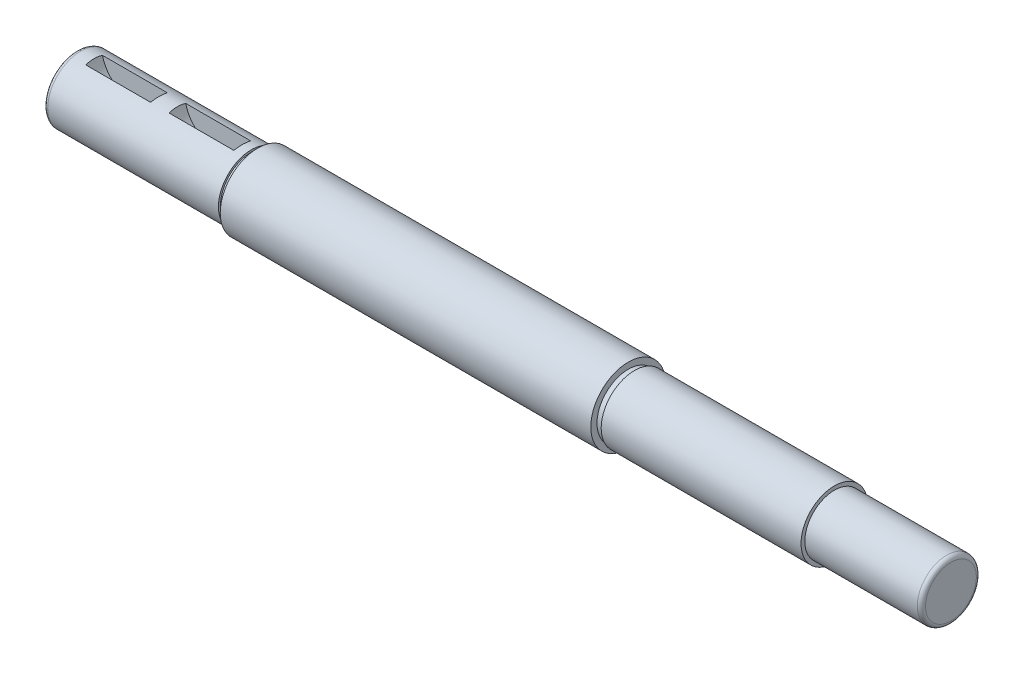
ISO-10303-21;
HEADER;
FILE_DESCRIPTION(('STEP AP214'),'2;1');
FILE_NAME('part.step','',(''),(''),'','','');
FILE_SCHEMA(('AUTOMOTIVE_DESIGN { 1 0 10303 214 1 1 1 1 }'));
ENDSEC;
DATA;
#1=APPLICATION_CONTEXT('core data for automotive mechanical design processes');
#2=APPLICATION_PROTOCOL_DEFINITION('international standard','automotive_design',2000,#1);
#3=PRODUCT_CONTEXT('',#1,'mechanical');
#4=PRODUCT('Part','Part','',(#3));
#5=PRODUCT_RELATED_PRODUCT_CATEGORY('part','',(#4));
#6=PRODUCT_DEFINITION_FORMATION('','',#4);
#7=PRODUCT_DEFINITION_CONTEXT('part definition',#1,'design');
#8=PRODUCT_DEFINITION('design','',#6,#7);
#9=PRODUCT_DEFINITION_SHAPE('','',#8);
#10=(LENGTH_UNIT() NAMED_UNIT(*) SI_UNIT(.MILLI.,.METRE.));
#11=(NAMED_UNIT(*) PLANE_ANGLE_UNIT() SI_UNIT($,.RADIAN.));
#12=(NAMED_UNIT(*) SI_UNIT($,.STERADIAN.) SOLID_ANGLE_UNIT());
#13=UNCERTAINTY_MEASURE_WITH_UNIT(LENGTH_MEASURE(1.E-05),#10,'distance_accuracy_value','');
#14=(GEOMETRIC_REPRESENTATION_CONTEXT(3) GLOBAL_UNCERTAINTY_ASSIGNED_CONTEXT((#13)) GLOBAL_UNIT_ASSIGNED_CONTEXT((#10,
#11,#12)) REPRESENTATION_CONTEXT('',''));
#15=CARTESIAN_POINT('',(0.,0.,0.));
#16=DIRECTION('',(0.,0.,1.));
#17=DIRECTION('',(1.,0.,0.));
#18=AXIS2_PLACEMENT_3D('',#15,#16,#17);
#19=CARTESIAN_POINT('',(-43.2188775510235,0.,0.));
#20=DIRECTION('',(-1.,0.,0.));
#21=DIRECTION('',(0.,0.,0.999999999999999));
#22=AXIS2_PLACEMENT_3D('',#19,#20,#21);
#23=CYLINDRICAL_SURFACE('',#22,12.573);
#24=CARTESIAN_POINT('',(-47.9318923712861,12.1655128950656,3.1749999999999));
#25=CARTESIAN_POINT('',(-47.9423587204252,12.2093989522607,3.00684567429126));
#26=CARTESIAN_POINT('',(-47.9517585812594,12.2498073403399,2.83774160807929));
#27=CARTESIAN_POINT('',(-47.9686036364341,12.3235949017887,2.49791376370056));
#28=CARTESIAN_POINT('',(-47.9760488716091,12.3569742220007,2.32719001944792));
#29=CARTESIAN_POINT('',(-47.9957208671903,12.4464611744974,1.81299330604268));
#30=CARTESIAN_POINT('',(-48.0052836232186,12.4919165162094,1.46749976980847));
#31=CARTESIAN_POINT('',(-48.0180752497638,12.5533273824793,0.781306161602188));
#32=CARTESIAN_POINT('',(-48.0214355502917,12.5698946152415,0.44066217812384));
#33=CARTESIAN_POINT('',(-48.0225404054115,12.5753104400998,-0.240715360624144));
#34=CARTESIAN_POINT('',(-48.0202870936926,12.5641695638298,-0.581448832655653));
#35=CARTESIAN_POINT('',(-48.0093757584653,12.5114222459546,-1.29937082874842));
#36=CARTESIAN_POINT('',(-48.0000211046213,12.4665075345471,-1.67631642960017));
#37=CARTESIAN_POINT('',(-47.9797005834582,12.3734388378274,-2.23946049091177));
#38=CARTESIAN_POINT('',(-47.9718116174037,12.3378374790666,-2.42793171445026));
#39=CARTESIAN_POINT('',(-47.9536777639308,12.2580731081272,-2.80298583265816));
#40=CARTESIAN_POINT('',(-47.9434323155065,12.2139080575913,-2.98956826660437));
#41=CARTESIAN_POINT('',(-47.9318923712861,12.1655128950655,-3.1750000000001));
#42=B_SPLINE_CURVE_WITH_KNOTS('',3,(#24,#25,#26,#27,#28,#29,#30,#31,#32,#33,#34,#35,#36,#37,#38,
#39,#40,#41),.UNSPECIFIED.,.F.,.F.,(4,2,2,2,2,2,2,2,4),(0.,0.522218817984299,1.044426725363,
2.08885774968565,3.11089136797897,4.13253657872747,5.26991720612298,5.8456320404076,
6.4214840767705),.UNSPECIFIED.);
#43=CARTESIAN_POINT('',(-47.9318923712861,12.1655128950656,3.1749999999999));
#44=VERTEX_POINT('',#43);
#45=CARTESIAN_POINT('',(-47.9318923712861,12.1655128950655,-3.1750000000001));
#46=VERTEX_POINT('',#45);
#47=EDGE_CURVE('E242',#44,#46,#42,.T.);
#48=ORIENTED_EDGE('',*,*,#47,.T.);
#49=DIRECTION('',(-1.,0.,0.));
#50=VECTOR('',#49,1.);
#51=CARTESIAN_POINT('',(-43.2188775510235,12.1655128950655,-3.1750000000001));
#52=LINE('',#51,#50);
#53=CARTESIAN_POINT('',(-23.2254300776882,12.1655128950655,-3.1750000000001));
#54=VERTEX_POINT('',#53);
#55=EDGE_CURVE('E334',#54,#46,#52,.T.);
#56=ORIENTED_EDGE('',*,*,#55,.F.);
#57=CARTESIAN_POINT('',(-23.2254300776882,12.1655128950655,-3.1750000000001));
#58=CARTESIAN_POINT('',(-23.214963728549,12.2093989522607,-3.00684567429146));
#59=CARTESIAN_POINT('',(-23.2055638677149,12.2498073403398,-2.83774160807948));
#60=CARTESIAN_POINT('',(-23.1887188125401,12.3235949017887,-2.49791376370075));
#61=CARTESIAN_POINT('',(-23.1812735773652,12.3569742220007,-2.32719001944811));
#62=CARTESIAN_POINT('',(-23.1616015817839,12.4464611744974,-1.81299330604286));
#63=CARTESIAN_POINT('',(-23.1520388257557,12.4919165162094,-1.46749976980864));
#64=CARTESIAN_POINT('',(-23.1392471992105,12.5533273824793,-0.781306161602339));
#65=CARTESIAN_POINT('',(-23.1358868986825,12.5698946152414,-0.440662178123988));
#66=CARTESIAN_POINT('',(-23.1347820435627,12.5753104400998,0.240715360624003));
#67=CARTESIAN_POINT('',(-23.1370353552817,12.5641695638299,0.581448832655516));
#68=CARTESIAN_POINT('',(-23.1479466905089,12.5114222459547,1.29937082874827));
#69=CARTESIAN_POINT('',(-23.1573013443529,12.4665075345471,1.6763164296));
#70=CARTESIAN_POINT('',(-23.177621865516,12.3734388378273,2.23946049091158));
#71=CARTESIAN_POINT('',(-23.1855108315705,12.3378374790666,2.42793171445008));
#72=CARTESIAN_POINT('',(-23.2036446850434,12.2580731081272,2.80298583265797));
#73=CARTESIAN_POINT('',(-23.2138901334677,12.2139080575914,2.98956826660418));
#74=CARTESIAN_POINT('',(-23.2254300776882,12.1655128950656,3.1749999999999));
#75=B_SPLINE_CURVE_WITH_KNOTS('',3,(#57,#58,#59,#60,#61,#62,#63,#64,#65,#66,#67,#68,#69,#70,#71,
#72,#73,#74),.UNSPECIFIED.,.F.,.F.,(4,2,2,2,2,2,2,2,4),(0.,0.522218817984299,1.04442672536301,
2.08885774968569,3.11089136797903,4.13253657872752,5.269917206123,5.84563204040762,
6.4214840767705),.UNSPECIFIED.);
#76=CARTESIAN_POINT('',(-23.2254300776882,12.1655128950656,3.1749999999999));
#77=VERTEX_POINT('',#76);
#78=EDGE_CURVE('E249',#54,#77,#75,.T.);
#79=ORIENTED_EDGE('',*,*,#78,.T.);
#80=DIRECTION('',(-1.,0.,0.));
#81=VECTOR('',#80,1.);
#82=CARTESIAN_POINT('',(-43.2188775510235,12.1655128950656,3.1749999999999));
#83=LINE('',#82,#81);
#84=EDGE_CURVE('E239',#77,#44,#83,.T.);
#85=ORIENTED_EDGE('',*,*,#84,.T.);
#86=EDGE_LOOP('',(#48,#56,#79,#85));
#87=FACE_BOUND('',#86,.T.);
#88=CARTESIAN_POINT('',(-53.0411612244871,0.,0.));
#89=DIRECTION('',(1.,0.,0.));
#90=DIRECTION('',(0.,0.,-0.999999999999999));
#91=AXIS2_PLACEMENT_3D('',#88,#89,#90);
#92=CIRCLE('',#91,12.573);
#93=CARTESIAN_POINT('',(-53.0411612244871,1.25629506797509E-13,-12.573));
#94=VERTEX_POINT('',#93);
#95=EDGE_CURVE('E236',#94,#94,#92,.T.);
#96=ORIENTED_EDGE('',*,*,#95,.T.);
#97=EDGE_LOOP('',(#96));
#98=FACE_BOUND('',#97,.T.);
#99=CARTESIAN_POINT('',(12.0463387755129,0.,0.));
#100=DIRECTION('',(-1.,0.,0.));
#101=DIRECTION('',(0.,0.,0.999999999999999));
#102=AXIS2_PLACEMENT_3D('',#99,#100,#101);
#103=CIRCLE('',#102,12.573);
#104=CARTESIAN_POINT('',(12.0463387755129,-1.25629506797509E-13,12.573));
#105=VERTEX_POINT('',#104);
#106=EDGE_CURVE('E224',#105,#105,#103,.T.);
#107=ORIENTED_EDGE('',*,*,#106,.T.);
#108=EDGE_LOOP('',(#107));
#109=FACE_BOUND('',#108,.T.);
#110=CARTESIAN_POINT('',(-16.1818923712861,12.1655128950656,3.1749999999999));
#111=CARTESIAN_POINT('',(-16.1923587204252,12.2093989522607,3.00684567429125));
#112=CARTESIAN_POINT('',(-16.2017585812594,12.2498073403398,2.83774160807928));
#113=CARTESIAN_POINT('',(-16.2186036364341,12.3235949017887,2.49791376370056));
#114=CARTESIAN_POINT('',(-16.2260488716091,12.3569742220007,2.32719001944793));
#115=CARTESIAN_POINT('',(-16.2457208671903,12.4464611744974,1.81299330604268));
#116=CARTESIAN_POINT('',(-16.2552836232186,12.4919165162094,1.46749976980847));
#117=CARTESIAN_POINT('',(-16.2680752497638,12.5533273824793,0.781306161602172));
#118=CARTESIAN_POINT('',(-16.2714355502917,12.5698946152414,0.440662178123828));
#119=CARTESIAN_POINT('',(-16.2725404054115,12.5753104400998,-0.24071536062415));
#120=CARTESIAN_POINT('',(-16.2702870936926,12.5641695638299,-0.581448832655656));
#121=CARTESIAN_POINT('',(-16.2593757584653,12.5114222459548,-1.2993708287484));
#122=CARTESIAN_POINT('',(-16.2500211046213,12.4665075345471,-1.67631642960012));
#123=CARTESIAN_POINT('',(-16.2297005834582,12.3734388378273,-2.2394604909117));
#124=CARTESIAN_POINT('',(-16.2218116174037,12.3378374790665,-2.4279317144502));
#125=CARTESIAN_POINT('',(-16.2036777639308,12.2580731081272,-2.80298583265809));
#126=CARTESIAN_POINT('',(-16.1934323155065,12.2139080575914,-2.98956826660431));
#127=CARTESIAN_POINT('',(-16.1818923712861,12.1655128950656,-3.17500000000005));
#128=B_SPLINE_CURVE_WITH_KNOTS('',3,(#110,#111,#112,#113,#114,#115,#116,#117,#118,#119,#120,
#121,#122,#123,#124,#125,#126,#127),.UNSPECIFIED.,.F.,.F.,(4,2,2,2,2,2,2,2,4),(0.,
0.522218817984276,1.04442672536296,2.08885774968564,3.11089136797896,4.13253657872742,
5.26991720612291,5.84563204040753,6.42148407677041),.UNSPECIFIED.);
#129=CARTESIAN_POINT('',(-16.1818923712861,12.1655128950656,3.1749999999999));
#130=VERTEX_POINT('',#129);
#131=CARTESIAN_POINT('',(-16.1818923712861,12.1655128950656,-3.17500000000005));
#132=VERTEX_POINT('',#131);
#133=EDGE_CURVE('E303',#130,#132,#128,.T.);
#134=ORIENTED_EDGE('',*,*,#133,.T.);
#135=DIRECTION('',(-1.,0.,0.));
#136=VECTOR('',#135,1.);
#137=CARTESIAN_POINT('',(-43.2188775510235,12.1655128950655,-3.1750000000001));
#138=LINE('',#137,#136);
#139=CARTESIAN_POINT('',(8.52456992231182,12.1655128950656,-3.17500000000005));
#140=VERTEX_POINT('',#139);
#141=EDGE_CURVE('E306',#140,#132,#138,.T.);
#142=ORIENTED_EDGE('',*,*,#141,.F.);
#143=CARTESIAN_POINT('',(8.52456992231182,12.1655128950656,-3.17500000000005));
#144=CARTESIAN_POINT('',(8.53503627145099,12.2093989522607,-3.00684567429139));
#145=CARTESIAN_POINT('',(8.54443613228513,12.2498073403398,-2.83774160807942));
#146=CARTESIAN_POINT('',(8.5612811874599,12.3235949017886,-2.49791376370069));
#147=CARTESIAN_POINT('',(8.56872642263484,12.3569742220006,-2.32719001944806));
#148=CARTESIAN_POINT('',(8.58839841821606,12.4464611744974,-1.81299330604281));
#149=CARTESIAN_POINT('',(8.59796117424434,12.4919165162094,-1.4674997698086));
#150=CARTESIAN_POINT('',(8.61075280078953,12.5533273824793,-0.781306161602295));
#151=CARTESIAN_POINT('',(8.61411310131751,12.5698946152414,-0.440662178123945));
#152=CARTESIAN_POINT('',(8.6152179564373,12.5753104400998,0.240715360624043));
#153=CARTESIAN_POINT('',(8.61296464471831,12.5641695638299,0.581448832655554));
#154=CARTESIAN_POINT('',(8.60205330949107,12.5114222459547,1.2993708287483));
#155=CARTESIAN_POINT('',(8.59269865564706,12.4665075345471,1.67631642960001));
#156=CARTESIAN_POINT('',(8.57237813448399,12.3734388378273,2.23946049091158));
#157=CARTESIAN_POINT('',(8.56448916842954,12.3378374790665,2.42793171445007));
#158=CARTESIAN_POINT('',(8.54635531495656,12.2580731081272,2.80298583265795));
#159=CARTESIAN_POINT('',(8.53610986653225,12.2139080575914,2.98956826660416));
#160=CARTESIAN_POINT('',(8.52456992231182,12.1655128950656,3.1749999999999));
#161=B_SPLINE_CURVE_WITH_KNOTS('',3,(#143,#144,#145,#146,#147,#148,#149,#150,#151,#152,#153,
#154,#155,#156,#157,#158,#159,#160),.UNSPECIFIED.,.F.,.F.,(4,2,2,2,2,2,2,2,4),(0.,
0.522218817984283,1.04442672536298,2.08885774968565,3.11089136797899,4.13253657872747,
5.26991720612293,5.84563204040753,6.42148407677039),.UNSPECIFIED.);
#162=CARTESIAN_POINT('',(8.52456992231182,12.1655128950656,3.1749999999999));
#163=VERTEX_POINT('',#162);
#164=EDGE_CURVE('E310',#140,#163,#161,.T.);
#165=ORIENTED_EDGE('',*,*,#164,.T.);
#166=DIRECTION('',(-1.,0.,0.));
#167=VECTOR('',#166,1.);
#168=CARTESIAN_POINT('',(-43.2188775510235,12.1655128950656,3.1749999999999));
#169=LINE('',#168,#167);
#170=EDGE_CURVE('E307',#163,#130,#169,.T.);
#171=ORIENTED_EDGE('',*,*,#170,.T.);
#172=EDGE_LOOP('',(#134,#142,#165,#171));
#173=FACE_BOUND('',#172,.T.);
#174=ADVANCED_FACE('F47',(#87,#98,#109,#173),#23,.T.);
#175=CARTESIAN_POINT('',(-54.6286612244871,0.,0.));
#176=DIRECTION('',(1.,0.,0.));
#177=DIRECTION('',(0.,0.,-0.999999999999999));
#178=AXIS2_PLACEMENT_3D('',#175,#176,#177);
#179=PLANE('',#178);
#180=CARTESIAN_POINT('',(-54.6286612244871,0.,0.));
#181=DIRECTION('',(1.,0.,0.));
#182=DIRECTION('',(0.,0.,-0.999999999999999));
#183=AXIS2_PLACEMENT_3D('',#180,#181,#182);
#184=CIRCLE('',#183,10.9855);
#185=CARTESIAN_POINT('',(-54.6286612244871,1.09767195333177E-13,-10.9855));
#186=VERTEX_POINT('',#185);
#187=EDGE_CURVE('E233',#186,#186,#184,.F.);
#188=ORIENTED_EDGE('',*,*,#187,.T.);
#189=EDGE_LOOP('',(#188));
#190=FACE_BOUND('',#189,.T.);
#191=ADVANCED_FACE('F285',(#190),#179,.F.);
#192=CARTESIAN_POINT('',(12.0463387755129,12.5730000000002,0.));
#193=DIRECTION('',(-1.,0.,0.));
#194=DIRECTION('',(0.,0.,0.999999999999999));
#195=AXIS2_PLACEMENT_3D('',#192,#193,#194);
#196=PLANE('',#195);
#197=ORIENTED_EDGE('',*,*,#106,.F.);
#198=EDGE_LOOP('',(#197));
#199=FACE_BOUND('',#198,.T.);
#200=CARTESIAN_POINT('',(12.0463387755129,0.,0.));
#201=DIRECTION('',(-1.,0.,0.));
#202=DIRECTION('',(0.,0.,0.999999999999999));
#203=AXIS2_PLACEMENT_3D('',#200,#201,#202);
#204=CIRCLE('',#203,11.77925);
#205=CARTESIAN_POINT('',(12.0463387755129,-1.17698351065343E-13,11.77925));
#206=VERTEX_POINT('',#205);
#207=EDGE_CURVE('E221',#206,#206,#204,.T.);
#208=ORIENTED_EDGE('',*,*,#207,.T.);
#209=EDGE_LOOP('',(#208));
#210=FACE_BOUND('',#209,.T.);
#211=ADVANCED_FACE('F290',(#199,#210),#196,.F.);
#212=CARTESIAN_POINT('',(-43.2188775510235,0.,0.));
#213=DIRECTION('',(-1.,0.,0.));
#214=DIRECTION('',(0.,0.,0.999999999999999));
#215=AXIS2_PLACEMENT_3D('',#212,#213,#214);
#216=CYLINDRICAL_SURFACE('',#215,11.77925);
#217=ORIENTED_EDGE('',*,*,#207,.F.);
#218=EDGE_LOOP('',(#217));
#219=FACE_BOUND('',#218,.T.);
#220=CARTESIAN_POINT('',(14.4275887755129,0.,0.));
#221=DIRECTION('',(-1.,0.,0.));
#222=DIRECTION('',(0.,0.,0.999999999999999));
#223=AXIS2_PLACEMENT_3D('',#220,#221,#222);
#224=CIRCLE('',#223,11.77925);
#225=CARTESIAN_POINT('',(14.4275887755129,-1.17698351065343E-13,11.77925));
#226=VERTEX_POINT('',#225);
#227=EDGE_CURVE('E218',#226,#226,#224,.T.);
#228=ORIENTED_EDGE('',*,*,#227,.T.);
#229=EDGE_LOOP('',(#228));
#230=FACE_BOUND('',#229,.T.);
#231=ADVANCED_FACE('F491',(#219,#230),#216,.T.);
#232=CARTESIAN_POINT('',(14.4275887755129,11.7792500000003,0.));
#233=DIRECTION('',(1.,0.,0.));
#234=DIRECTION('',(0.,0.,-0.999999999999999));
#235=AXIS2_PLACEMENT_3D('',#232,#233,#234);
#236=PLANE('',#235);
#237=ORIENTED_EDGE('',*,*,#227,.F.);
#238=EDGE_LOOP('',(#237));
#239=FACE_BOUND('',#238,.T.);
#240=CARTESIAN_POINT('',(14.4275887755129,0.,0.));
#241=DIRECTION('',(-1.,0.,0.));
#242=DIRECTION('',(0.,0.,0.999999999999999));
#243=AXIS2_PLACEMENT_3D('',#240,#241,#242);
#244=CIRCLE('',#243,14.2748);
#245=CARTESIAN_POINT('',(14.4275887755129,-1.42633904687273E-13,14.2748));
#246=VERTEX_POINT('',#245);
#247=EDGE_CURVE('E215',#246,#246,#244,.T.);
#248=ORIENTED_EDGE('',*,*,#247,.T.);
#249=EDGE_LOOP('',(#248));
#250=FACE_BOUND('',#249,.T.);
#251=ADVANCED_FACE('F482',(#239,#250),#236,.F.);
#252=CARTESIAN_POINT('',(-43.2188775510235,0.,0.));
#253=DIRECTION('',(-1.,0.,0.));
#254=DIRECTION('',(0.,0.,0.999999999999999));
#255=AXIS2_PLACEMENT_3D('',#252,#253,#254);
#256=CYLINDRICAL_SURFACE('',#255,14.2748);
#257=ORIENTED_EDGE('',*,*,#247,.F.);
#258=EDGE_LOOP('',(#257));
#259=FACE_BOUND('',#258,.T.);
#260=CARTESIAN_POINT('',(155.715088775513,1.94289029309402E-13,0.));
#261=DIRECTION('',(-1.,0.,0.));
#262=DIRECTION('',(0.,0.,0.999999999999999));
#263=AXIS2_PLACEMENT_3D('',#260,#261,#262);
#264=CIRCLE('',#263,14.2748);
#265=CARTESIAN_POINT('',(155.715088775513,0.,14.2748));
#266=VERTEX_POINT('',#265);
#267=EDGE_CURVE('E212',#266,#266,#264,.T.);
#268=ORIENTED_EDGE('',*,*,#267,.T.);
#269=EDGE_LOOP('',(#268));
#270=FACE_BOUND('',#269,.T.);
#271=ADVANCED_FACE('F473',(#259,#270),#256,.T.);
#272=CARTESIAN_POINT('',(155.715088775513,14.2748000000005,-1.70002900645727E-13));
#273=DIRECTION('',(-1.,0.,0.));
#274=DIRECTION('',(0.,0.,0.999999999999999));
#275=AXIS2_PLACEMENT_3D('',#272,#273,#274);
#276=PLANE('',#275);
#277=ORIENTED_EDGE('',*,*,#267,.F.);
#278=EDGE_LOOP('',(#277));
#279=FACE_BOUND('',#278,.T.);
#280=CARTESIAN_POINT('',(155.715088775513,1.94289029309402E-13,0.));
#281=DIRECTION('',(-1.,0.,0.));
#282=DIRECTION('',(0.,0.,0.999999999999999));
#283=AXIS2_PLACEMENT_3D('',#280,#281,#282);
#284=CIRCLE('',#283,11.9126);
#285=CARTESIAN_POINT('',(155.715088775513,0.,11.9126));
#286=VERTEX_POINT('',#285);
#287=EDGE_CURVE('E209',#286,#286,#284,.T.);
#288=ORIENTED_EDGE('',*,*,#287,.T.);
#289=EDGE_LOOP('',(#288));
#290=FACE_BOUND('',#289,.T.);
#291=ADVANCED_FACE('F464',(#279,#290),#276,.F.);
#292=CARTESIAN_POINT('',(-43.2188775510235,0.,0.));
#293=DIRECTION('',(-1.,0.,0.));
#294=DIRECTION('',(0.,0.,0.999999999999999));
#295=AXIS2_PLACEMENT_3D('',#292,#293,#294);
#296=CYLINDRICAL_SURFACE('',#295,11.9126);
#297=ORIENTED_EDGE('',*,*,#287,.F.);
#298=EDGE_LOOP('',(#297));
#299=FACE_BOUND('',#298,.T.);
#300=CARTESIAN_POINT('',(158.096338775513,1.94289029309402E-13,0.));
#301=DIRECTION('',(-1.,0.,0.));
#302=DIRECTION('',(0.,0.,0.999999999999999));
#303=AXIS2_PLACEMENT_3D('',#300,#301,#302);
#304=CIRCLE('',#303,11.9126);
#305=CARTESIAN_POINT('',(158.096338775513,0.,11.9126));
#306=VERTEX_POINT('',#305);
#307=EDGE_CURVE('E206',#306,#306,#304,.T.);
#308=ORIENTED_EDGE('',*,*,#307,.T.);
#309=EDGE_LOOP('',(#308));
#310=FACE_BOUND('',#309,.T.);
#311=ADVANCED_FACE('F456',(#299,#310),#296,.T.);
#312=CARTESIAN_POINT('',(158.096338775513,11.9126000000003,0.));
#313=DIRECTION('',(1.,0.,0.));
#314=DIRECTION('',(0.,0.,-0.999999999999999));
#315=AXIS2_PLACEMENT_3D('',#312,#313,#314);
#316=PLANE('',#315);
#317=ORIENTED_EDGE('',*,*,#307,.F.);
#318=EDGE_LOOP('',(#317));
#319=FACE_BOUND('',#318,.T.);
#320=CARTESIAN_POINT('',(158.096338775513,1.94289029309402E-13,0.));
#321=DIRECTION('',(-1.,0.,0.));
#322=DIRECTION('',(0.,0.,0.999999999999999));
#323=AXIS2_PLACEMENT_3D('',#320,#321,#322);
#324=CIRCLE('',#323,12.70635);
#325=CARTESIAN_POINT('',(158.096338775513,0.,12.70635));
#326=VERTEX_POINT('',#325);
#327=EDGE_CURVE('E203',#326,#326,#324,.T.);
#328=ORIENTED_EDGE('',*,*,#327,.T.);
#329=EDGE_LOOP('',(#328));
#330=FACE_BOUND('',#329,.T.);
#331=ADVANCED_FACE('F281',(#319,#330),#316,.F.);
#332=CARTESIAN_POINT('',(-43.2188775510235,0.,0.));
#333=DIRECTION('',(-1.,0.,0.));
#334=DIRECTION('',(0.,0.,0.999999999999999));
#335=AXIS2_PLACEMENT_3D('',#332,#333,#334);
#336=CYLINDRICAL_SURFACE('',#335,12.70635);
#337=CARTESIAN_POINT('',(225.219373074706,-12.303280266762,3.17500000000001));
#338=CARTESIAN_POINT('',(225.229822273497,-12.3471642383812,3.0049486631984));
#339=CARTESIAN_POINT('',(225.239197201386,-12.3875312541663,2.83394895664347));
#340=CARTESIAN_POINT('',(225.255978671013,-12.4611579252856,2.49033196690938));
#341=CARTESIAN_POINT('',(225.26338523157,-12.4944176485716,2.31771469921197));
#342=CARTESIAN_POINT('',(225.282923192225,-12.5834283953145,1.79784145874841));
#343=CARTESIAN_POINT('',(225.292372351811,-12.6284087284307,1.4485728335441));
#344=CARTESIAN_POINT('',(225.304892755237,-12.6885828043217,0.754904803232514));
#345=CARTESIAN_POINT('',(225.308095082169,-12.7043883577387,0.410559342499162));
#346=CARTESIAN_POINT('',(225.308827897382,-12.7079669708953,-0.278203723184332));
#347=CARTESIAN_POINT('',(225.306360626226,-12.6957511043939,-0.622621245869365));
#348=CARTESIAN_POINT('',(225.298006378383,-12.6554579444139,-1.15122268998387));
#349=CARTESIAN_POINT('',(225.294214012504,-12.6372592683025,-1.33624986187984));
#350=CARTESIAN_POINT('',(225.284793227423,-12.5927738137791,-1.70525502447845));
#351=CARTESIAN_POINT('',(225.279165200354,-12.5664887628475,-1.88923323072825));
#352=CARTESIAN_POINT('',(225.265852017295,-12.5055348277949,-2.25792953450258));
#353=CARTESIAN_POINT('',(225.258143602332,-12.470771608409,-2.44263117614148));
#354=CARTESIAN_POINT('',(225.240489141967,-12.3931072620523,-2.81025839253146));
#355=CARTESIAN_POINT('',(225.230542504211,-12.3502039812606,-2.99318348371951));
#356=CARTESIAN_POINT('',(225.219373074706,-12.3032802667621,-3.17499999999991));
#357=B_SPLINE_CURVE_WITH_KNOTS('',3,(#337,#338,#339,#340,#341,#342,#343,#344,#345,#346,#347,
#348,#349,#350,#351,#352,#353,#354,#355,#356),.UNSPECIFIED.,.F.,.F.,(4,2,2,2,2,2,2,2,2,4),(0.,
0.527710566514907,1.0554160874373,2.11085430237413,3.1438963713921,4.17653026381357,
4.73424845576773,5.29184758584574,5.85595932758116,6.42022053924778),.UNSPECIFIED.);
#358=CARTESIAN_POINT('',(225.219373074706,-12.303280266762,3.17500000000001));
#359=VERTEX_POINT('',#358);
#360=CARTESIAN_POINT('',(225.219373074706,-12.3032802667621,-3.17499999999991));
#361=VERTEX_POINT('',#360);
#362=EDGE_CURVE('E114',#359,#361,#357,.T.);
#363=ORIENTED_EDGE('',*,*,#362,.T.);
#364=DIRECTION('',(-1.,0.,0.));
#365=VECTOR('',#364,1.);
#366=CARTESIAN_POINT('',(-43.2188775510235,-12.3032802667621,-3.1749999999999));
#367=LINE('',#366,#365);
#368=CARTESIAN_POINT('',(200.510804476319,-12.3032802667622,-3.17499999999997));
#369=VERTEX_POINT('',#368);
#370=EDGE_CURVE('E13',#361,#369,#367,.T.);
#371=ORIENTED_EDGE('',*,*,#370,.T.);
#372=CARTESIAN_POINT('',(200.510804476319,-12.3032802667622,-3.17499999999997));
#373=CARTESIAN_POINT('',(200.500355277529,-12.3471642383812,-3.00494866319835));
#374=CARTESIAN_POINT('',(200.49098034964,-12.3875312541663,-2.83394895664342));
#375=CARTESIAN_POINT('',(200.474198880013,-12.4611579252856,-2.49033196690933));
#376=CARTESIAN_POINT('',(200.466792319456,-12.4944176485716,-2.31771469921192));
#377=CARTESIAN_POINT('',(200.447254358801,-12.5834283953145,-1.79784145874835));
#378=CARTESIAN_POINT('',(200.437805199214,-12.6284087284307,-1.44857283354403));
#379=CARTESIAN_POINT('',(200.425284795789,-12.6885828043216,-0.754904803232427));
#380=CARTESIAN_POINT('',(200.422082468857,-12.7043883577386,-0.410559342499075));
#381=CARTESIAN_POINT('',(200.421349653644,-12.7079669708954,0.278203723184428));
#382=CARTESIAN_POINT('',(200.4238169248,-12.6957511043941,0.622621245869467));
#383=CARTESIAN_POINT('',(200.432171172643,-12.655457944414,1.15122268998395));
#384=CARTESIAN_POINT('',(200.435963538522,-12.6372592683025,1.33624986187991));
#385=CARTESIAN_POINT('',(200.445384323603,-12.592773813779,1.7052550244785));
#386=CARTESIAN_POINT('',(200.451012350672,-12.5664887628475,1.8892332307283));
#387=CARTESIAN_POINT('',(200.464325533731,-12.5055348277949,2.25792953450262));
#388=CARTESIAN_POINT('',(200.472033948694,-12.4707716084089,2.44263117614151));
#389=CARTESIAN_POINT('',(200.489688409059,-12.3931072620523,2.81025839253148));
#390=CARTESIAN_POINT('',(200.499635046815,-12.3502039812606,2.99318348371954));
#391=CARTESIAN_POINT('',(200.510804476319,-12.3032802667621,3.17499999999996));
#392=B_SPLINE_CURVE_WITH_KNOTS('',3,(#372,#373,#374,#375,#376,#377,#378,#379,#380,#381,#382,
#383,#384,#385,#386,#387,#388,#389,#390,#391),.UNSPECIFIED.,.F.,.F.,(4,2,2,2,2,2,2,2,2,4),(0.,
0.52771056651489,1.05541608743728,2.11085430237413,3.14389637139212,4.17653026381358,
4.73424845576772,5.29184758584572,5.85595932758111,6.42022053924773),.UNSPECIFIED.);
#393=CARTESIAN_POINT('',(200.510804476319,-12.3032802667621,3.17499999999996));
#394=VERTEX_POINT('',#393);
#395=EDGE_CURVE('E55',#369,#394,#392,.T.);
#396=ORIENTED_EDGE('',*,*,#395,.T.);
#397=DIRECTION('',(-1.,0.,0.));
#398=VECTOR('',#397,1.);
#399=CARTESIAN_POINT('',(-43.2188775510235,-12.3032802667623,3.17500000000001));
#400=LINE('',#399,#398);
#401=EDGE_CURVE('E110',#359,#394,#400,.T.);
#402=ORIENTED_EDGE('',*,*,#401,.F.);
#403=EDGE_LOOP('',(#363,#371,#396,#402));
#404=FACE_BOUND('',#403,.T.);
#405=CARTESIAN_POINT('',(187.119373074706,-12.3032802667621,3.17499999999996));
#406=CARTESIAN_POINT('',(187.129822273497,-12.3471642383812,3.00494866319834));
#407=CARTESIAN_POINT('',(187.139197201386,-12.3875312541663,2.83394895664341));
#408=CARTESIAN_POINT('',(187.155978671013,-12.4611579252856,2.49033196690932));
#409=CARTESIAN_POINT('',(187.16338523157,-12.4944176485716,2.31771469921192));
#410=CARTESIAN_POINT('',(187.182923192225,-12.5834283953145,1.79784145874837));
#411=CARTESIAN_POINT('',(187.192372351811,-12.6284087284307,1.44857283354407));
#412=CARTESIAN_POINT('',(187.204892755237,-12.6885828043216,0.754904803232492));
#413=CARTESIAN_POINT('',(187.208095082168,-12.7043883577386,0.410559342499144));
#414=CARTESIAN_POINT('',(187.208827897382,-12.7079669708953,-0.278203723184343));
#415=CARTESIAN_POINT('',(187.206360626226,-12.6957511043939,-0.622621245869373));
#416=CARTESIAN_POINT('',(187.198006378383,-12.6554579444139,-1.15122268998387));
#417=CARTESIAN_POINT('',(187.194214012504,-12.6372592683024,-1.33624986187984));
#418=CARTESIAN_POINT('',(187.184793227423,-12.5927738137791,-1.70525502447846));
#419=CARTESIAN_POINT('',(187.179165200354,-12.5664887628475,-1.88923323072826));
#420=CARTESIAN_POINT('',(187.165852017295,-12.5055348277949,-2.2579295345026));
#421=CARTESIAN_POINT('',(187.158143602332,-12.4707716084089,-2.4426311761415));
#422=CARTESIAN_POINT('',(187.140489141967,-12.3931072620523,-2.81025839253148));
#423=CARTESIAN_POINT('',(187.130542504211,-12.3502039812607,-2.99318348371955));
#424=CARTESIAN_POINT('',(187.119373074706,-12.3032802667622,-3.17499999999997));
#425=B_SPLINE_CURVE_WITH_KNOTS('',3,(#405,#406,#407,#408,#409,#410,#411,#412,#413,#414,#415,
#416,#417,#418,#419,#420,#421,#422,#423,#424),.UNSPECIFIED.,.F.,.F.,(4,2,2,2,2,2,2,2,2,4),(0.,
0.527710566514883,1.05541608743726,2.11085430237406,3.14389637139203,4.17653026381348,
4.73424845576765,5.29184758584567,5.85595932758109,6.42022053924772),.UNSPECIFIED.);
#426=CARTESIAN_POINT('',(187.119373074706,-12.3032802667621,3.17499999999996));
#427=VERTEX_POINT('',#426);
#428=CARTESIAN_POINT('',(187.119373074706,-12.3032802667622,-3.17499999999997));
#429=VERTEX_POINT('',#428);
#430=EDGE_CURVE('E162',#427,#429,#425,.T.);
#431=ORIENTED_EDGE('',*,*,#430,.T.);
#432=DIRECTION('',(-1.,0.,0.));
#433=VECTOR('',#432,1.);
#434=CARTESIAN_POINT('',(-43.2188775510235,-12.3032802667621,-3.1749999999999));
#435=LINE('',#434,#433);
#436=CARTESIAN_POINT('',(162.410804476319,-12.3032802667622,-3.17499999999997));
#437=VERTEX_POINT('',#436);
#438=EDGE_CURVE('E115',#429,#437,#435,.T.);
#439=ORIENTED_EDGE('',*,*,#438,.T.);
#440=CARTESIAN_POINT('',(162.410804476319,-12.3032802667622,-3.17499999999997));
#441=CARTESIAN_POINT('',(162.400355277529,-12.3471642383812,-3.00494866319835));
#442=CARTESIAN_POINT('',(162.39098034964,-12.3875312541663,-2.83394895664341));
#443=CARTESIAN_POINT('',(162.374198880013,-12.4611579252855,-2.49033196690932));
#444=CARTESIAN_POINT('',(162.366792319456,-12.4944176485716,-2.31771469921192));
#445=CARTESIAN_POINT('',(162.347254358801,-12.5834283953145,-1.79784145874835));
#446=CARTESIAN_POINT('',(162.337805199214,-12.6284087284307,-1.44857283354403));
#447=CARTESIAN_POINT('',(162.325284795789,-12.6885828043216,-0.754904803232417));
#448=CARTESIAN_POINT('',(162.322082468857,-12.7043883577385,-0.410559342499065));
#449=CARTESIAN_POINT('',(162.321349653644,-12.7079669708953,0.278203723184438));
#450=CARTESIAN_POINT('',(162.3238169248,-12.6957511043941,0.62262124586948));
#451=CARTESIAN_POINT('',(162.332171172643,-12.655457944414,1.15122268998395));
#452=CARTESIAN_POINT('',(162.335963538522,-12.6372592683024,1.3362498618799));
#453=CARTESIAN_POINT('',(162.345384323603,-12.592773813779,1.70525502447848));
#454=CARTESIAN_POINT('',(162.351012350672,-12.5664887628474,1.88923323072828));
#455=CARTESIAN_POINT('',(162.364325533731,-12.5055348277949,2.2579295345026));
#456=CARTESIAN_POINT('',(162.372033948694,-12.4707716084089,2.44263117614149));
#457=CARTESIAN_POINT('',(162.389688409059,-12.3931072620523,2.81025839253146));
#458=CARTESIAN_POINT('',(162.399635046815,-12.3502039812606,2.99318348371952));
#459=CARTESIAN_POINT('',(162.410804476319,-12.3032802667621,3.17499999999995));
#460=B_SPLINE_CURVE_WITH_KNOTS('',3,(#440,#441,#442,#443,#444,#445,#446,#447,#448,#449,#450,
#451,#452,#453,#454,#455,#456,#457,#458,#459),.UNSPECIFIED.,.F.,.F.,(4,2,2,2,2,2,2,2,2,4),(0.,
0.527710566514881,1.05541608743727,2.11085430237413,3.14389637139213,4.17653026381357,
4.73424845576771,5.2918475858457,5.85595932758108,6.4202205392477),.UNSPECIFIED.);
#461=CARTESIAN_POINT('',(162.410804476319,-12.3032802667621,3.17499999999995));
#462=VERTEX_POINT('',#461);
#463=EDGE_CURVE('E168',#437,#462,#460,.T.);
#464=ORIENTED_EDGE('',*,*,#463,.T.);
#465=DIRECTION('',(-1.,0.,0.));
#466=VECTOR('',#465,1.);
#467=CARTESIAN_POINT('',(-43.2188775510235,-12.3032802667623,3.17500000000001));
#468=LINE('',#467,#466);
#469=EDGE_CURVE('E313',#427,#462,#468,.T.);
#470=ORIENTED_EDGE('',*,*,#469,.F.);
#471=EDGE_LOOP('',(#431,#439,#464,#470));
#472=FACE_BOUND('',#471,.T.);
#473=ORIENTED_EDGE('',*,*,#327,.F.);
#474=EDGE_LOOP('',(#473));
#475=FACE_BOUND('',#474,.T.);
#476=CARTESIAN_POINT('',(234.296338775513,1.66533453693773E-13,0.));
#477=DIRECTION('',(-1.,0.,0.));
#478=DIRECTION('',(0.,0.,0.999999999999999));
#479=AXIS2_PLACEMENT_3D('',#476,#477,#478);
#480=CIRCLE('',#479,12.70635);
#481=CARTESIAN_POINT('',(234.296338775513,0.,12.70635));
#482=VERTEX_POINT('',#481);
#483=EDGE_CURVE('E200',#482,#482,#480,.T.);
#484=ORIENTED_EDGE('',*,*,#483,.T.);
#485=EDGE_LOOP('',(#484));
#486=FACE_BOUND('',#485,.T.);
#487=ADVANCED_FACE('F123',(#404,#472,#475,#486),#336,.T.);
#488=CARTESIAN_POINT('',(234.296338775513,12.7063500000004,0.));
#489=DIRECTION('',(-1.,0.,0.));
#490=DIRECTION('',(0.,0.,0.999999999999999));
#491=AXIS2_PLACEMENT_3D('',#488,#489,#490);
#492=PLANE('',#491);
#493=ORIENTED_EDGE('',*,*,#483,.F.);
#494=EDGE_LOOP('',(#493));
#495=FACE_BOUND('',#494,.T.);
#496=CARTESIAN_POINT('',(234.296338775513,1.66533453693773E-13,0.));
#497=DIRECTION('',(-1.,0.,0.));
#498=DIRECTION('',(0.,0.,0.999999999999999));
#499=AXIS2_PLACEMENT_3D('',#496,#497,#498);
#500=CIRCLE('',#499,11.2649);
#501=CARTESIAN_POINT('',(234.296338775513,0.,11.2649));
#502=VERTEX_POINT('',#501);
#503=EDGE_CURVE('E195',#502,#502,#500,.T.);
#504=ORIENTED_EDGE('',*,*,#503,.T.);
#505=EDGE_LOOP('',(#504));
#506=FACE_BOUND('',#505,.T.);
#507=ADVANCED_FACE('F274',(#495,#506),#492,.F.);
#508=CARTESIAN_POINT('',(-43.2188775510235,0.,0.));
#509=DIRECTION('',(-1.,0.,0.));
#510=DIRECTION('',(0.,0.,0.999999999999999));
#511=AXIS2_PLACEMENT_3D('',#508,#509,#510);
#512=CYLINDRICAL_SURFACE('',#511,11.2649);
#513=CARTESIAN_POINT('',(277.158838775513,1.66533453693773E-13,0.));
#514=DIRECTION('',(-1.,0.,0.));
#515=DIRECTION('',(0.,0.,0.999999999999999));
#516=AXIS2_PLACEMENT_3D('',#513,#514,#515);
#517=CIRCLE('',#516,11.2649);
#518=CARTESIAN_POINT('',(277.158838775513,0.,11.2649));
#519=VERTEX_POINT('',#518);
#520=EDGE_CURVE('E227',#519,#519,#517,.T.);
#521=ORIENTED_EDGE('',*,*,#520,.T.);
#522=EDGE_LOOP('',(#521));
#523=FACE_BOUND('',#522,.T.);
#524=ORIENTED_EDGE('',*,*,#503,.F.);
#525=EDGE_LOOP('',(#524));
#526=FACE_BOUND('',#525,.T.);
#527=ADVANCED_FACE('F271',(#523,#526),#512,.T.);
#528=CARTESIAN_POINT('',(278.746338775513,11.2649000000004,0.));
#529=DIRECTION('',(-1.,0.,0.));
#530=DIRECTION('',(0.,0.,0.999999999999999));
#531=AXIS2_PLACEMENT_3D('',#528,#529,#530);
#532=PLANE('',#531);
#533=CARTESIAN_POINT('',(278.746338775513,1.66533453693773E-13,0.));
#534=DIRECTION('',(-1.,0.,0.));
#535=DIRECTION('',(0.,0.,0.999999999999999));
#536=AXIS2_PLACEMENT_3D('',#533,#534,#535);
#537=CIRCLE('',#536,9.6774);
#538=CARTESIAN_POINT('',(278.746338775513,0.,9.67739999999998));
#539=VERTEX_POINT('',#538);
#540=EDGE_CURVE('E230',#539,#539,#537,.F.);
#541=ORIENTED_EDGE('',*,*,#540,.T.);
#542=EDGE_LOOP('',(#541));
#543=FACE_BOUND('',#542,.T.);
#544=ADVANCED_FACE('F266',(#543),#532,.F.);
#545=CARTESIAN_POINT('',(277.158838775513,1.66533453693773E-13,0.));
#546=DIRECTION('',(-1.,0.,0.));
#547=DIRECTION('',(0.,0.,0.999999999999999));
#548=AXIS2_PLACEMENT_3D('',#545,#546,#547);
#549=TOROIDAL_SURFACE('',#548,9.6774,1.5875);
#550=ORIENTED_EDGE('',*,*,#540,.F.);
#551=EDGE_LOOP('',(#550));
#552=FACE_BOUND('',#551,.T.);
#553=ORIENTED_EDGE('',*,*,#520,.F.);
#554=EDGE_LOOP('',(#553));
#555=FACE_BOUND('',#554,.T.);
#556=ADVANCED_FACE('F270',(#552,#555),#549,.T.);
#557=CARTESIAN_POINT('',(-53.0411612244871,0.,0.));
#558=DIRECTION('',(1.,0.,0.));
#559=DIRECTION('',(0.,0.,-0.999999999999999));
#560=AXIS2_PLACEMENT_3D('',#557,#558,#559);
#561=TOROIDAL_SURFACE('',#560,10.9855,1.5875);
#562=ORIENTED_EDGE('',*,*,#95,.F.);
#563=EDGE_LOOP('',(#562));
#564=FACE_BOUND('',#563,.T.);
#565=ORIENTED_EDGE('',*,*,#187,.F.);
#566=EDGE_LOOP('',(#565));
#567=FACE_BOUND('',#566,.T.);
#568=ADVANCED_FACE('F49',(#564,#567),#561,.T.);
#569=CARTESIAN_POINT('',(-35.5786612244871,15.1130000000001,-3.17500000000003));
#570=DIRECTION('',(0.,0.,0.999999999999999));
#571=DIRECTION('',(1.,0.,0.));
#572=AXIS2_PLACEMENT_3D('',#569,#570,#571);
#573=CYLINDRICAL_SURFACE('',#572,12.7);
#574=CARTESIAN_POINT('',(-35.5786612244871,15.1130000000001,-3.17500000000003));
#575=DIRECTION('',(0.,0.,0.999999999999999));
#576=DIRECTION('',(1.,0.,0.));
#577=AXIS2_PLACEMENT_3D('',#574,#575,#576);
#578=CIRCLE('',#577,12.7);
#579=EDGE_CURVE('E192',#46,#54,#578,.T.);
#580=ORIENTED_EDGE('',*,*,#579,.F.);
#581=ORIENTED_EDGE('',*,*,#47,.F.);
#582=CARTESIAN_POINT('',(-35.5786612244871,15.1130000000002,3.17499999999994));
#583=DIRECTION('',(0.,0.,0.999999999999999));
#584=DIRECTION('',(1.,0.,0.));
#585=AXIS2_PLACEMENT_3D('',#582,#583,#584);
#586=CIRCLE('',#585,12.7);
#587=EDGE_CURVE('E190',#44,#77,#586,.T.);
#588=ORIENTED_EDGE('',*,*,#587,.T.);
#589=ORIENTED_EDGE('',*,*,#78,.F.);
#590=EDGE_LOOP('',(#580,#581,#588,#589));
#591=FACE_BOUND('',#590,.T.);
#592=ADVANCED_FACE('F257',(#591),#573,.F.);
#593=CARTESIAN_POINT('',(-35.5786612244871,15.1130000000001,-3.17500000000003));
#594=DIRECTION('',(0.,0.,0.999999999999999));
#595=DIRECTION('',(1.,0.,0.));
#596=AXIS2_PLACEMENT_3D('',#593,#594,#595);
#597=PLANE('',#596);
#598=ORIENTED_EDGE('',*,*,#55,.T.);
#599=ORIENTED_EDGE('',*,*,#579,.T.);
#600=EDGE_LOOP('',(#598,#599));
#601=FACE_BOUND('',#600,.T.);
#602=ADVANCED_FACE('F262',(#601),#597,.T.);
#603=CARTESIAN_POINT('',(-35.5786612244871,15.1130000000002,3.17499999999994));
#604=DIRECTION('',(0.,0.,0.999999999999999));
#605=DIRECTION('',(1.,0.,0.));
#606=AXIS2_PLACEMENT_3D('',#603,#604,#605);
#607=PLANE('',#606);
#608=ORIENTED_EDGE('',*,*,#587,.F.);
#609=ORIENTED_EDGE('',*,*,#84,.F.);
#610=EDGE_LOOP('',(#608,#609));
#611=FACE_BOUND('',#610,.T.);
#612=ADVANCED_FACE('F264',(#611),#607,.F.);
#613=CARTESIAN_POINT('',(-3.82866122448711,15.1130000000001,-3.17500000000003));
#614=DIRECTION('',(0.,0.,0.999999999999999));
#615=DIRECTION('',(1.,0.,0.));
#616=AXIS2_PLACEMENT_3D('',#613,#614,#615);
#617=CYLINDRICAL_SURFACE('',#616,12.7);
#618=CARTESIAN_POINT('',(-3.82866122448711,15.1130000000001,-3.17500000000003));
#619=DIRECTION('',(0.,0.,0.999999999999999));
#620=DIRECTION('',(1.,0.,0.));
#621=AXIS2_PLACEMENT_3D('',#618,#619,#620);
#622=CIRCLE('',#621,12.7);
#623=EDGE_CURVE('E184',#132,#140,#622,.T.);
#624=ORIENTED_EDGE('',*,*,#623,.F.);
#625=ORIENTED_EDGE('',*,*,#133,.F.);
#626=CARTESIAN_POINT('',(-3.82866122448711,15.1130000000002,3.17499999999995));
#627=DIRECTION('',(0.,0.,0.999999999999999));
#628=DIRECTION('',(1.,0.,0.));
#629=AXIS2_PLACEMENT_3D('',#626,#627,#628);
#630=CIRCLE('',#629,12.7);
#631=EDGE_CURVE('E181',#130,#163,#630,.T.);
#632=ORIENTED_EDGE('',*,*,#631,.T.);
#633=ORIENTED_EDGE('',*,*,#164,.F.);
#634=EDGE_LOOP('',(#624,#625,#632,#633));
#635=FACE_BOUND('',#634,.T.);
#636=ADVANCED_FACE('F315',(#635),#617,.F.);
#637=CARTESIAN_POINT('',(-3.82866122448711,15.1130000000001,-3.17500000000003));
#638=DIRECTION('',(0.,0.,0.999999999999999));
#639=DIRECTION('',(1.,0.,0.));
#640=AXIS2_PLACEMENT_3D('',#637,#638,#639);
#641=PLANE('',#640);
#642=ORIENTED_EDGE('',*,*,#141,.T.);
#643=ORIENTED_EDGE('',*,*,#623,.T.);
#644=EDGE_LOOP('',(#642,#643));
#645=FACE_BOUND('',#644,.T.);
#646=ADVANCED_FACE('F158',(#645),#641,.T.);
#647=CARTESIAN_POINT('',(-3.82866122448711,15.1130000000002,3.17499999999995));
#648=DIRECTION('',(0.,0.,0.999999999999999));
#649=DIRECTION('',(1.,0.,0.));
#650=AXIS2_PLACEMENT_3D('',#647,#648,#649);
#651=PLANE('',#650);
#652=ORIENTED_EDGE('',*,*,#631,.F.);
#653=ORIENTED_EDGE('',*,*,#170,.F.);
#654=EDGE_LOOP('',(#652,#653));
#655=FACE_BOUND('',#654,.T.);
#656=ADVANCED_FACE('F156',(#655),#651,.F.);
#657=CARTESIAN_POINT('',(174.765088775513,-15.24635,-3.17499999999992));
#658=DIRECTION('',(0.,0.,0.999999999999999));
#659=DIRECTION('',(1.,0.,0.));
#660=AXIS2_PLACEMENT_3D('',#657,#658,#659);
#661=CYLINDRICAL_SURFACE('',#660,12.7);
#662=CARTESIAN_POINT('',(174.765088775513,-15.24635,-3.17499999999992));
#663=DIRECTION('',(0.,0.,0.999999999999999));
#664=DIRECTION('',(-1.,0.,0.));
#665=AXIS2_PLACEMENT_3D('',#662,#663,#664);
#666=CIRCLE('',#665,12.7);
#667=EDGE_CURVE('E180',#429,#437,#666,.T.);
#668=ORIENTED_EDGE('',*,*,#667,.F.);
#669=ORIENTED_EDGE('',*,*,#430,.F.);
#670=CARTESIAN_POINT('',(174.765088775513,-15.2463500000002,3.17500000000003));
#671=DIRECTION('',(0.,0.,0.999999999999999));
#672=DIRECTION('',(-1.,0.,0.));
#673=AXIS2_PLACEMENT_3D('',#670,#671,#672);
#674=CIRCLE('',#673,12.7);
#675=EDGE_CURVE('E68',#427,#462,#674,.T.);
#676=ORIENTED_EDGE('',*,*,#675,.T.);
#677=ORIENTED_EDGE('',*,*,#463,.F.);
#678=EDGE_LOOP('',(#668,#669,#676,#677));
#679=FACE_BOUND('',#678,.T.);
#680=ADVANCED_FACE('F149',(#679),#661,.F.);
#681=CARTESIAN_POINT('',(174.765088775513,-15.24635,-3.17499999999992));
#682=DIRECTION('',(0.,0.,-0.999999999999999));
#683=DIRECTION('',(-1.,0.,0.));
#684=AXIS2_PLACEMENT_3D('',#681,#682,#683);
#685=PLANE('',#684);
#686=ORIENTED_EDGE('',*,*,#667,.T.);
#687=ORIENTED_EDGE('',*,*,#438,.F.);
#688=EDGE_LOOP('',(#686,#687));
#689=FACE_BOUND('',#688,.T.);
#690=ADVANCED_FACE('F145',(#689),#685,.F.);
#691=CARTESIAN_POINT('',(174.765088775513,-15.2463500000002,3.17500000000003));
#692=DIRECTION('',(0.,0.,-0.999999999999999));
#693=DIRECTION('',(-1.,0.,0.));
#694=AXIS2_PLACEMENT_3D('',#691,#692,#693);
#695=PLANE('',#694);
#696=ORIENTED_EDGE('',*,*,#469,.T.);
#697=ORIENTED_EDGE('',*,*,#675,.F.);
#698=EDGE_LOOP('',(#696,#697));
#699=FACE_BOUND('',#698,.T.);
#700=ADVANCED_FACE('F143',(#699),#695,.T.);
#701=CARTESIAN_POINT('',(212.865088775513,-15.24635,-3.17499999999992));
#702=DIRECTION('',(0.,0.,0.999999999999999));
#703=DIRECTION('',(1.,0.,0.));
#704=AXIS2_PLACEMENT_3D('',#701,#702,#703);
#705=CYLINDRICAL_SURFACE('',#704,12.7);
#706=CARTESIAN_POINT('',(212.865088775513,-15.24635,-3.17499999999992));
#707=DIRECTION('',(0.,0.,0.999999999999999));
#708=DIRECTION('',(-1.,0.,0.));
#709=AXIS2_PLACEMENT_3D('',#706,#707,#708);
#710=CIRCLE('',#709,12.7);
#711=EDGE_CURVE('E121',#361,#369,#710,.T.);
#712=ORIENTED_EDGE('',*,*,#711,.F.);
#713=ORIENTED_EDGE('',*,*,#362,.F.);
#714=CARTESIAN_POINT('',(212.865088775513,-15.2463500000002,3.17500000000008));
#715=DIRECTION('',(0.,0.,0.999999999999999));
#716=DIRECTION('',(-1.,0.,0.));
#717=AXIS2_PLACEMENT_3D('',#714,#715,#716);
#718=CIRCLE('',#717,12.7);
#719=EDGE_CURVE('E61',#359,#394,#718,.T.);
#720=ORIENTED_EDGE('',*,*,#719,.T.);
#721=ORIENTED_EDGE('',*,*,#395,.F.);
#722=EDGE_LOOP('',(#712,#713,#720,#721));
#723=FACE_BOUND('',#722,.T.);
#724=ADVANCED_FACE('F119',(#723),#705,.F.);
#725=CARTESIAN_POINT('',(212.865088775513,-15.24635,-3.17499999999992));
#726=DIRECTION('',(0.,0.,-0.999999999999999));
#727=DIRECTION('',(-1.,0.,0.));
#728=AXIS2_PLACEMENT_3D('',#725,#726,#727);
#729=PLANE('',#728);
#730=ORIENTED_EDGE('',*,*,#711,.T.);
#731=ORIENTED_EDGE('',*,*,#370,.F.);
#732=EDGE_LOOP('',(#730,#731));
#733=FACE_BOUND('',#732,.T.);
#734=ADVANCED_FACE('F142',(#733),#729,.F.);
#735=CARTESIAN_POINT('',(212.865088775513,-15.2463500000002,3.17500000000008));
#736=DIRECTION('',(0.,0.,-0.999999999999999));
#737=DIRECTION('',(-1.,0.,0.));
#738=AXIS2_PLACEMENT_3D('',#735,#736,#737);
#739=PLANE('',#738);
#740=ORIENTED_EDGE('',*,*,#401,.T.);
#741=ORIENTED_EDGE('',*,*,#719,.F.);
#742=EDGE_LOOP('',(#740,#741));
#743=FACE_BOUND('',#742,.T.);
#744=ADVANCED_FACE('F111',(#743),#739,.T.);
#745=CLOSED_SHELL('',(#174,#191,#211,#231,#251,#271,#291,#311,#331,#487,#507,#527,#544,#556,
#568,#592,#602,#612,#636,#646,#656,#680,#690,#700,#724,#734,#744));
#746=MANIFOLD_SOLID_BREP('B2',#745);
#747=ADVANCED_BREP_SHAPE_REPRESENTATION('',(#18,#746),#14);
#748=SHAPE_DEFINITION_REPRESENTATION(#9,#747);
ENDSEC;
END-ISO-10303-21;
